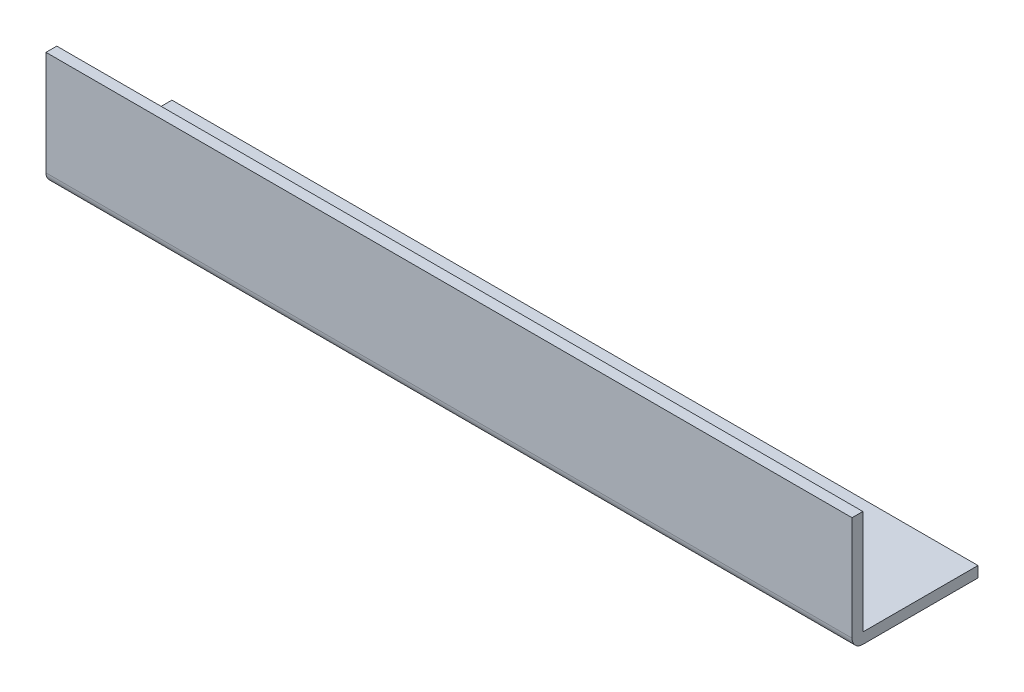
ISO-10303-21;
HEADER;
FILE_DESCRIPTION(('STEP AP214'),'2;1');
FILE_NAME('part.step','',(''),(''),'','','');
FILE_SCHEMA(('AUTOMOTIVE_DESIGN { 1 0 10303 214 1 1 1 1 }'));
ENDSEC;
DATA;
#1=APPLICATION_CONTEXT('core data for automotive mechanical design processes');
#2=APPLICATION_PROTOCOL_DEFINITION('international standard','automotive_design',2000,#1);
#3=PRODUCT_CONTEXT('',#1,'mechanical');
#4=PRODUCT('Part','Part','',(#3));
#5=PRODUCT_RELATED_PRODUCT_CATEGORY('part','',(#4));
#6=PRODUCT_DEFINITION_FORMATION('','',#4);
#7=PRODUCT_DEFINITION_CONTEXT('part definition',#1,'design');
#8=PRODUCT_DEFINITION('design','',#6,#7);
#9=PRODUCT_DEFINITION_SHAPE('','',#8);
#10=(LENGTH_UNIT() NAMED_UNIT(*) SI_UNIT(.MILLI.,.METRE.));
#11=(NAMED_UNIT(*) PLANE_ANGLE_UNIT() SI_UNIT($,.RADIAN.));
#12=(NAMED_UNIT(*) SI_UNIT($,.STERADIAN.) SOLID_ANGLE_UNIT());
#13=UNCERTAINTY_MEASURE_WITH_UNIT(LENGTH_MEASURE(1.E-05),#10,'distance_accuracy_value','');
#14=(GEOMETRIC_REPRESENTATION_CONTEXT(3) GLOBAL_UNCERTAINTY_ASSIGNED_CONTEXT((#13)) GLOBAL_UNIT_ASSIGNED_CONTEXT((#10,
#11,#12)) REPRESENTATION_CONTEXT('',''));
#15=CARTESIAN_POINT('',(0.,0.,0.));
#16=DIRECTION('',(0.,0.,1.));
#17=DIRECTION('',(1.,0.,0.));
#18=AXIS2_PLACEMENT_3D('',#15,#16,#17);
#19=CARTESIAN_POINT('',(0.,2.38125,0.));
#20=DIRECTION('',(1.,0.,0.));
#21=DIRECTION('',(0.,0.,-1.));
#22=AXIS2_PLACEMENT_3D('',#19,#20,#21);
#23=PLANE('',#22);
#24=DIRECTION('',(0.,0.,1.));
#25=VECTOR('',#24,1.);
#26=CARTESIAN_POINT('',(0.,0.,0.));
#27=LINE('',#26,#25);
#28=CARTESIAN_POINT('',(0.,0.,-25.4));
#29=VERTEX_POINT('',#28);
#30=CARTESIAN_POINT('',(0.,0.,0.));
#31=VERTEX_POINT('',#30);
#32=EDGE_CURVE('E108',#29,#31,#27,.T.);
#33=ORIENTED_EDGE('',*,*,#32,.T.);
#34=CARTESIAN_POINT('',(0.,2.38125,0.));
#35=DIRECTION('',(1.,0.,0.));
#36=DIRECTION('',(0.,0.,-1.));
#37=AXIS2_PLACEMENT_3D('',#34,#35,#36);
#38=CIRCLE('',#37,2.38125);
#39=CARTESIAN_POINT('',(0.,2.38125,2.38125));
#40=VERTEX_POINT('',#39);
#41=EDGE_CURVE('E11',#31,#40,#38,.F.);
#42=ORIENTED_EDGE('',*,*,#41,.T.);
#43=DIRECTION('',(0.,-1.,0.));
#44=VECTOR('',#43,1.);
#45=CARTESIAN_POINT('',(0.,0.,2.38125));
#46=LINE('',#45,#44);
#47=CARTESIAN_POINT('',(0.,25.4,2.38125));
#48=VERTEX_POINT('',#47);
#49=EDGE_CURVE('E99',#48,#40,#46,.T.);
#50=ORIENTED_EDGE('',*,*,#49,.F.);
#51=DIRECTION('',(0.,0.,-1.));
#52=VECTOR('',#51,1.);
#53=CARTESIAN_POINT('',(0.,25.4,2.38125));
#54=LINE('',#53,#52);
#55=CARTESIAN_POINT('',(0.,25.4,0.));
#56=VERTEX_POINT('',#55);
#57=EDGE_CURVE('E109',#48,#56,#54,.T.);
#58=ORIENTED_EDGE('',*,*,#57,.T.);
#59=DIRECTION('',(0.,-1.,0.));
#60=VECTOR('',#59,1.);
#61=CARTESIAN_POINT('',(0.,0.,0.));
#62=LINE('',#61,#60);
#63=CARTESIAN_POINT('',(0.,2.38125,0.));
#64=VERTEX_POINT('',#63);
#65=EDGE_CURVE('E118',#56,#64,#62,.T.);
#66=ORIENTED_EDGE('',*,*,#65,.T.);
#67=DIRECTION('',(0.,0.,1.));
#68=VECTOR('',#67,1.);
#69=CARTESIAN_POINT('',(0.,2.38125,0.));
#70=LINE('',#69,#68);
#71=CARTESIAN_POINT('',(0.,2.38125,-25.4));
#72=VERTEX_POINT('',#71);
#73=EDGE_CURVE('E124',#72,#64,#70,.T.);
#74=ORIENTED_EDGE('',*,*,#73,.F.);
#75=DIRECTION('',(0.,-1.,0.));
#76=VECTOR('',#75,1.);
#77=CARTESIAN_POINT('',(0.,2.38125,-25.4));
#78=LINE('',#77,#76);
#79=EDGE_CURVE('E135',#72,#29,#78,.T.);
#80=ORIENTED_EDGE('',*,*,#79,.T.);
#81=EDGE_LOOP('',(#33,#42,#50,#58,#66,#74,#80));
#82=FACE_BOUND('',#81,.T.);
#83=ADVANCED_FACE('F33',(#82),#23,.F.);
#84=CARTESIAN_POINT('',(177.8,2.38125,0.));
#85=DIRECTION('',(-1.,0.,0.));
#86=DIRECTION('',(0.,0.,1.));
#87=AXIS2_PLACEMENT_3D('',#84,#85,#86);
#88=PLANE('',#87);
#89=DIRECTION('',(0.,1.,0.));
#90=VECTOR('',#89,1.);
#91=CARTESIAN_POINT('',(177.8,0.,2.38125));
#92=LINE('',#91,#90);
#93=CARTESIAN_POINT('',(177.8,2.38125,2.38125));
#94=VERTEX_POINT('',#93);
#95=CARTESIAN_POINT('',(177.8,25.4,2.38125));
#96=VERTEX_POINT('',#95);
#97=EDGE_CURVE('E90',#94,#96,#92,.T.);
#98=ORIENTED_EDGE('',*,*,#97,.F.);
#99=CARTESIAN_POINT('',(177.8,2.38125,0.));
#100=DIRECTION('',(-1.,0.,0.));
#101=DIRECTION('',(0.,0.,1.));
#102=AXIS2_PLACEMENT_3D('',#99,#100,#101);
#103=CIRCLE('',#102,2.38125);
#104=CARTESIAN_POINT('',(177.8,0.,0.));
#105=VERTEX_POINT('',#104);
#106=EDGE_CURVE('E55',#94,#105,#103,.F.);
#107=ORIENTED_EDGE('',*,*,#106,.T.);
#108=DIRECTION('',(0.,0.,-1.));
#109=VECTOR('',#108,1.);
#110=CARTESIAN_POINT('',(177.8,0.,0.));
#111=LINE('',#110,#109);
#112=CARTESIAN_POINT('',(177.8,0.,-25.4));
#113=VERTEX_POINT('',#112);
#114=EDGE_CURVE('E137',#105,#113,#111,.T.);
#115=ORIENTED_EDGE('',*,*,#114,.T.);
#116=DIRECTION('',(0.,-1.,0.));
#117=VECTOR('',#116,1.);
#118=CARTESIAN_POINT('',(177.8,2.38125,-25.4));
#119=LINE('',#118,#117);
#120=CARTESIAN_POINT('',(177.8,2.38125,-25.4));
#121=VERTEX_POINT('',#120);
#122=EDGE_CURVE('E142',#121,#113,#119,.T.);
#123=ORIENTED_EDGE('',*,*,#122,.F.);
#124=DIRECTION('',(0.,0.,-1.));
#125=VECTOR('',#124,1.);
#126=CARTESIAN_POINT('',(177.8,2.38125,0.));
#127=LINE('',#126,#125);
#128=CARTESIAN_POINT('',(177.8,2.38125,0.));
#129=VERTEX_POINT('',#128);
#130=EDGE_CURVE('E131',#129,#121,#127,.T.);
#131=ORIENTED_EDGE('',*,*,#130,.F.);
#132=DIRECTION('',(0.,1.,0.));
#133=VECTOR('',#132,1.);
#134=CARTESIAN_POINT('',(177.8,0.,0.));
#135=LINE('',#134,#133);
#136=CARTESIAN_POINT('',(177.8,25.4,0.));
#137=VERTEX_POINT('',#136);
#138=EDGE_CURVE('E105',#129,#137,#135,.T.);
#139=ORIENTED_EDGE('',*,*,#138,.T.);
#140=DIRECTION('',(0.,0.,-1.));
#141=VECTOR('',#140,1.);
#142=CARTESIAN_POINT('',(177.8,25.4,2.38125));
#143=LINE('',#142,#141);
#144=EDGE_CURVE('E102',#96,#137,#143,.T.);
#145=ORIENTED_EDGE('',*,*,#144,.F.);
#146=EDGE_LOOP('',(#98,#107,#115,#123,#131,#139,#145));
#147=FACE_BOUND('',#146,.T.);
#148=ADVANCED_FACE('F103',(#147),#88,.F.);
#149=CARTESIAN_POINT('',(0.,2.38125,-25.4));
#150=DIRECTION('',(0.,0.,1.));
#151=DIRECTION('',(1.,0.,0.));
#152=AXIS2_PLACEMENT_3D('',#149,#150,#151);
#153=PLANE('',#152);
#154=DIRECTION('',(-1.,0.,0.));
#155=VECTOR('',#154,1.);
#156=CARTESIAN_POINT('',(0.,0.,-25.4));
#157=LINE('',#156,#155);
#158=EDGE_CURVE('E128',#113,#29,#157,.T.);
#159=ORIENTED_EDGE('',*,*,#158,.T.);
#160=ORIENTED_EDGE('',*,*,#79,.F.);
#161=DIRECTION('',(-1.,0.,0.));
#162=VECTOR('',#161,1.);
#163=CARTESIAN_POINT('',(0.,2.38125,-25.4));
#164=LINE('',#163,#162);
#165=EDGE_CURVE('E133',#121,#72,#164,.T.);
#166=ORIENTED_EDGE('',*,*,#165,.F.);
#167=ORIENTED_EDGE('',*,*,#122,.T.);
#168=EDGE_LOOP('',(#159,#160,#166,#167));
#169=FACE_BOUND('',#168,.T.);
#170=ADVANCED_FACE('F150',(#169),#153,.F.);
#171=CARTESIAN_POINT('',(0.,2.38125,0.));
#172=DIRECTION('',(0.,-1.,0.));
#173=DIRECTION('',(0.,0.,-1.));
#174=AXIS2_PLACEMENT_3D('',#171,#172,#173);
#175=PLANE('',#174);
#176=ORIENTED_EDGE('',*,*,#73,.T.);
#177=DIRECTION('',(1.,0.,0.));
#178=VECTOR('',#177,1.);
#179=CARTESIAN_POINT('',(0.,2.38125,0.));
#180=LINE('',#179,#178);
#181=EDGE_CURVE('E127',#64,#129,#180,.T.);
#182=ORIENTED_EDGE('',*,*,#181,.T.);
#183=ORIENTED_EDGE('',*,*,#130,.T.);
#184=ORIENTED_EDGE('',*,*,#165,.T.);
#185=EDGE_LOOP('',(#176,#182,#183,#184));
#186=FACE_BOUND('',#185,.T.);
#187=ADVANCED_FACE('F170',(#186),#175,.F.);
#188=CARTESIAN_POINT('',(0.,0.,0.));
#189=DIRECTION('',(0.,-1.,0.));
#190=DIRECTION('',(0.,0.,-1.));
#191=AXIS2_PLACEMENT_3D('',#188,#189,#190);
#192=PLANE('',#191);
#193=ORIENTED_EDGE('',*,*,#114,.F.);
#194=DIRECTION('',(1.,0.,0.));
#195=VECTOR('',#194,1.);
#196=CARTESIAN_POINT('',(0.,0.,0.));
#197=LINE('',#196,#195);
#198=EDGE_CURVE('E41',#105,#31,#197,.F.);
#199=ORIENTED_EDGE('',*,*,#198,.T.);
#200=ORIENTED_EDGE('',*,*,#32,.F.);
#201=ORIENTED_EDGE('',*,*,#158,.F.);
#202=EDGE_LOOP('',(#193,#199,#200,#201));
#203=FACE_BOUND('',#202,.T.);
#204=ADVANCED_FACE('F152',(#203),#192,.T.);
#205=CARTESIAN_POINT('',(0.,0.,0.));
#206=DIRECTION('',(0.,0.,-1.));
#207=DIRECTION('',(-1.,0.,0.));
#208=AXIS2_PLACEMENT_3D('',#205,#206,#207);
#209=PLANE('',#208);
#210=ORIENTED_EDGE('',*,*,#181,.F.);
#211=ORIENTED_EDGE('',*,*,#65,.F.);
#212=DIRECTION('',(-1.,0.,0.));
#213=VECTOR('',#212,1.);
#214=CARTESIAN_POINT('',(0.,25.4,0.));
#215=LINE('',#214,#213);
#216=EDGE_CURVE('E122',#137,#56,#215,.T.);
#217=ORIENTED_EDGE('',*,*,#216,.F.);
#218=ORIENTED_EDGE('',*,*,#138,.F.);
#219=EDGE_LOOP('',(#210,#211,#217,#218));
#220=FACE_BOUND('',#219,.T.);
#221=ADVANCED_FACE('F173',(#220),#209,.T.);
#222=CARTESIAN_POINT('',(0.,25.4,2.38125));
#223=DIRECTION('',(0.,-1.,0.));
#224=DIRECTION('',(0.,0.,-1.));
#225=AXIS2_PLACEMENT_3D('',#222,#223,#224);
#226=PLANE('',#225);
#227=ORIENTED_EDGE('',*,*,#216,.T.);
#228=ORIENTED_EDGE('',*,*,#57,.F.);
#229=DIRECTION('',(-1.,0.,0.));
#230=VECTOR('',#229,1.);
#231=CARTESIAN_POINT('',(0.,25.4,2.38125));
#232=LINE('',#231,#230);
#233=EDGE_CURVE('E95',#96,#48,#232,.T.);
#234=ORIENTED_EDGE('',*,*,#233,.F.);
#235=ORIENTED_EDGE('',*,*,#144,.T.);
#236=EDGE_LOOP('',(#227,#228,#234,#235));
#237=FACE_BOUND('',#236,.T.);
#238=ADVANCED_FACE('F111',(#237),#226,.F.);
#239=CARTESIAN_POINT('',(0.,0.,2.38125));
#240=DIRECTION('',(0.,0.,-1.));
#241=DIRECTION('',(-1.,0.,0.));
#242=AXIS2_PLACEMENT_3D('',#239,#240,#241);
#243=PLANE('',#242);
#244=ORIENTED_EDGE('',*,*,#49,.T.);
#245=DIRECTION('',(1.,0.,0.));
#246=VECTOR('',#245,1.);
#247=CARTESIAN_POINT('',(177.8,2.38125,2.38125));
#248=LINE('',#247,#246);
#249=EDGE_CURVE('E98',#40,#94,#248,.T.);
#250=ORIENTED_EDGE('',*,*,#249,.T.);
#251=ORIENTED_EDGE('',*,*,#97,.T.);
#252=ORIENTED_EDGE('',*,*,#233,.T.);
#253=EDGE_LOOP('',(#244,#250,#251,#252));
#254=FACE_BOUND('',#253,.T.);
#255=ADVANCED_FACE('F93',(#254),#243,.F.);
#256=CARTESIAN_POINT('',(0.,2.38125,0.));
#257=DIRECTION('',(-1.,0.,0.));
#258=DIRECTION('',(0.,0.,1.));
#259=AXIS2_PLACEMENT_3D('',#256,#257,#258);
#260=CYLINDRICAL_SURFACE('',#259,2.38125);
#261=ORIENTED_EDGE('',*,*,#41,.F.);
#262=ORIENTED_EDGE('',*,*,#198,.F.);
#263=ORIENTED_EDGE('',*,*,#106,.F.);
#264=ORIENTED_EDGE('',*,*,#249,.F.);
#265=EDGE_LOOP('',(#261,#262,#263,#264));
#266=FACE_BOUND('',#265,.T.);
#267=ADVANCED_FACE('F35',(#266),#260,.T.);
#268=CLOSED_SHELL('',(#83,#148,#170,#187,#204,#221,#238,#255,#267));
#269=MANIFOLD_SOLID_BREP('B2',#268);
#270=ADVANCED_BREP_SHAPE_REPRESENTATION('',(#18,#269),#14);
#271=SHAPE_DEFINITION_REPRESENTATION(#9,#270);
ENDSEC;
END-ISO-10303-21;
